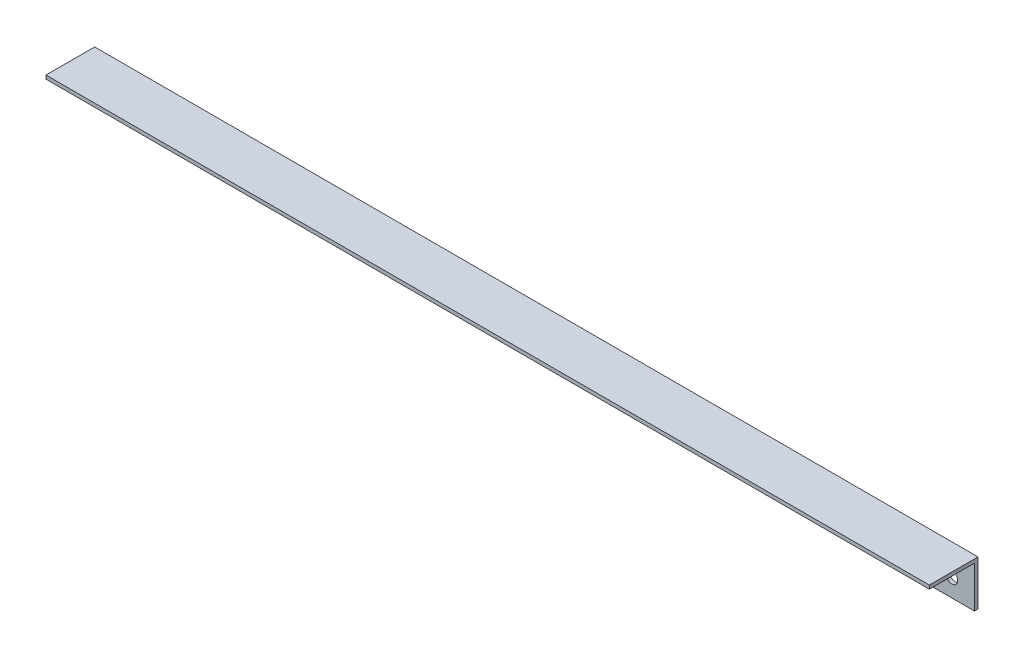
ISO-10303-21;
HEADER;
FILE_DESCRIPTION(('STEP AP214'),'2;1');
FILE_NAME('part.step','',(''),(''),'','','');
FILE_SCHEMA(('AUTOMOTIVE_DESIGN { 1 0 10303 214 1 1 1 1 }'));
ENDSEC;
DATA;
#1=APPLICATION_CONTEXT('core data for automotive mechanical design processes');
#2=APPLICATION_PROTOCOL_DEFINITION('international standard','automotive_design',2000,#1);
#3=PRODUCT_CONTEXT('',#1,'mechanical');
#4=PRODUCT('Part','Part','',(#3));
#5=PRODUCT_RELATED_PRODUCT_CATEGORY('part','',(#4));
#6=PRODUCT_DEFINITION_FORMATION('','',#4);
#7=PRODUCT_DEFINITION_CONTEXT('part definition',#1,'design');
#8=PRODUCT_DEFINITION('design','',#6,#7);
#9=PRODUCT_DEFINITION_SHAPE('','',#8);
#10=(LENGTH_UNIT() NAMED_UNIT(*) SI_UNIT(.MILLI.,.METRE.));
#11=(NAMED_UNIT(*) PLANE_ANGLE_UNIT() SI_UNIT($,.RADIAN.));
#12=(NAMED_UNIT(*) SI_UNIT($,.STERADIAN.) SOLID_ANGLE_UNIT());
#13=UNCERTAINTY_MEASURE_WITH_UNIT(LENGTH_MEASURE(1.E-05),#10,'distance_accuracy_value','');
#14=(GEOMETRIC_REPRESENTATION_CONTEXT(3) GLOBAL_UNCERTAINTY_ASSIGNED_CONTEXT((#13)) GLOBAL_UNIT_ASSIGNED_CONTEXT((#10,
#11,#12)) REPRESENTATION_CONTEXT('',''));
#15=CARTESIAN_POINT('',(0.,0.,0.));
#16=DIRECTION('',(0.,0.,1.));
#17=DIRECTION('',(1.,0.,0.));
#18=AXIS2_PLACEMENT_3D('',#15,#16,#17);
#19=CARTESIAN_POINT('',(-980.,-5.48788481732075,8.));
#20=DIRECTION('',(0.,0.,1.));
#21=DIRECTION('',(1.,0.,0.));
#22=AXIS2_PLACEMENT_3D('',#19,#20,#21);
#23=PLANE('',#22);
#24=DIRECTION('',(1.,0.,0.));
#25=VECTOR('',#24,1.);
#26=CARTESIAN_POINT('',(-980.,86.5121151826793,8.));
#27=LINE('',#26,#25);
#28=CARTESIAN_POINT('',(-980.,86.5121151826793,8.));
#29=VERTEX_POINT('',#28);
#30=CARTESIAN_POINT('',(980.,86.5121151826793,8.));
#31=VERTEX_POINT('',#30);
#32=EDGE_CURVE('E49',#29,#31,#27,.T.);
#33=ORIENTED_EDGE('',*,*,#32,.F.);
#34=DIRECTION('',(0.,-1.,0.));
#35=VECTOR('',#34,1.);
#36=CARTESIAN_POINT('',(-980.,94.5121151826794,8.));
#37=LINE('',#36,#35);
#38=CARTESIAN_POINT('',(-980.,-5.48788481732075,8.));
#39=VERTEX_POINT('',#38);
#40=EDGE_CURVE('E86',#29,#39,#37,.T.);
#41=ORIENTED_EDGE('',*,*,#40,.T.);
#42=DIRECTION('',(1.,0.,0.));
#43=VECTOR('',#42,1.);
#44=CARTESIAN_POINT('',(-980.,-5.48788481732075,8.));
#45=LINE('',#44,#43);
#46=CARTESIAN_POINT('',(980.,-5.48788481732075,8.));
#47=VERTEX_POINT('',#46);
#48=EDGE_CURVE('E55',#39,#47,#45,.T.);
#49=ORIENTED_EDGE('',*,*,#48,.T.);
#50=DIRECTION('',(0.,1.,0.));
#51=VECTOR('',#50,1.);
#52=CARTESIAN_POINT('',(980.,94.5121151826794,8.));
#53=LINE('',#52,#51);
#54=EDGE_CURVE('E97',#47,#31,#53,.T.);
#55=ORIENTED_EDGE('',*,*,#54,.T.);
#56=EDGE_LOOP('',(#33,#41,#49,#55));
#57=FACE_BOUND('',#56,.T.);
#58=CARTESIAN_POINT('',(-330.,34.5121151826793,8.));
#59=DIRECTION('',(0.,0.,1.));
#60=DIRECTION('',(-1.,0.,0.));
#61=AXIS2_PLACEMENT_3D('',#58,#59,#60);
#62=CIRCLE('',#61,13.);
#63=CARTESIAN_POINT('',(-343.,34.5121151826793,8.));
#64=VERTEX_POINT('',#63);
#65=EDGE_CURVE('E143',#64,#64,#62,.T.);
#66=ORIENTED_EDGE('',*,*,#65,.F.);
#67=EDGE_LOOP('',(#66));
#68=FACE_BOUND('',#67,.T.);
#69=CARTESIAN_POINT('',(-170.,34.5121151826792,8.));
#70=DIRECTION('',(0.,0.,1.));
#71=DIRECTION('',(-1.,0.,0.));
#72=AXIS2_PLACEMENT_3D('',#69,#70,#71);
#73=CIRCLE('',#72,13.);
#74=CARTESIAN_POINT('',(-183.,34.5121151826792,8.));
#75=VERTEX_POINT('',#74);
#76=EDGE_CURVE('E155',#75,#75,#73,.T.);
#77=ORIENTED_EDGE('',*,*,#76,.F.);
#78=EDGE_LOOP('',(#77));
#79=FACE_BOUND('',#78,.T.);
#80=CARTESIAN_POINT('',(-850.,34.5121151826793,8.));
#81=DIRECTION('',(0.,0.,1.));
#82=DIRECTION('',(-1.,0.,0.));
#83=AXIS2_PLACEMENT_3D('',#80,#81,#82);
#84=CIRCLE('',#83,13.);
#85=CARTESIAN_POINT('',(-863.,34.5121151826793,8.));
#86=VERTEX_POINT('',#85);
#87=EDGE_CURVE('E167',#86,#86,#84,.T.);
#88=ORIENTED_EDGE('',*,*,#87,.F.);
#89=EDGE_LOOP('',(#88));
#90=FACE_BOUND('',#89,.T.);
#91=CARTESIAN_POINT('',(250.,34.5121151826793,8.));
#92=DIRECTION('',(0.,0.,1.));
#93=DIRECTION('',(1.,0.,0.));
#94=AXIS2_PLACEMENT_3D('',#91,#92,#93);
#95=CIRCLE('',#94,13.);
#96=CARTESIAN_POINT('',(263.,34.5121151826793,8.));
#97=VERTEX_POINT('',#96);
#98=EDGE_CURVE('E179',#97,#97,#95,.T.);
#99=ORIENTED_EDGE('',*,*,#98,.F.);
#100=EDGE_LOOP('',(#99));
#101=FACE_BOUND('',#100,.T.);
#102=CARTESIAN_POINT('',(770.,34.5121151826793,8.));
#103=DIRECTION('',(0.,0.,1.));
#104=DIRECTION('',(1.,0.,0.));
#105=AXIS2_PLACEMENT_3D('',#102,#103,#104);
#106=CIRCLE('',#105,13.);
#107=CARTESIAN_POINT('',(783.,34.5121151826793,8.));
#108=VERTEX_POINT('',#107);
#109=EDGE_CURVE('E191',#108,#108,#106,.T.);
#110=ORIENTED_EDGE('',*,*,#109,.F.);
#111=EDGE_LOOP('',(#110));
#112=FACE_BOUND('',#111,.T.);
#113=CARTESIAN_POINT('',(930.,34.5121151826793,8.));
#114=DIRECTION('',(0.,0.,1.));
#115=DIRECTION('',(1.,0.,0.));
#116=AXIS2_PLACEMENT_3D('',#113,#114,#115);
#117=CIRCLE('',#116,13.);
#118=CARTESIAN_POINT('',(943.,34.5121151826793,8.));
#119=VERTEX_POINT('',#118);
#120=EDGE_CURVE('E102',#119,#119,#117,.T.);
#121=ORIENTED_EDGE('',*,*,#120,.F.);
#122=EDGE_LOOP('',(#121));
#123=FACE_BOUND('',#122,.T.);
#124=CARTESIAN_POINT('',(850.,34.5121151826793,8.));
#125=DIRECTION('',(0.,0.,1.));
#126=DIRECTION('',(1.,0.,0.));
#127=AXIS2_PLACEMENT_3D('',#124,#125,#126);
#128=CIRCLE('',#127,13.);
#129=CARTESIAN_POINT('',(863.,34.5121151826793,8.));
#130=VERTEX_POINT('',#129);
#131=EDGE_CURVE('E197',#130,#130,#128,.T.);
#132=ORIENTED_EDGE('',*,*,#131,.F.);
#133=EDGE_LOOP('',(#132));
#134=FACE_BOUND('',#133,.T.);
#135=CARTESIAN_POINT('',(330.,34.5121151826793,8.));
#136=DIRECTION('',(0.,0.,1.));
#137=DIRECTION('',(1.,0.,0.));
#138=AXIS2_PLACEMENT_3D('',#135,#136,#137);
#139=CIRCLE('',#138,13.);
#140=CARTESIAN_POINT('',(343.,34.5121151826793,8.));
#141=VERTEX_POINT('',#140);
#142=EDGE_CURVE('E185',#141,#141,#139,.T.);
#143=ORIENTED_EDGE('',*,*,#142,.F.);
#144=EDGE_LOOP('',(#143));
#145=FACE_BOUND('',#144,.T.);
#146=CARTESIAN_POINT('',(-770.,34.5121151826793,8.));
#147=DIRECTION('',(0.,0.,1.));
#148=DIRECTION('',(-1.,0.,0.));
#149=AXIS2_PLACEMENT_3D('',#146,#147,#148);
#150=CIRCLE('',#149,13.);
#151=CARTESIAN_POINT('',(-783.,34.5121151826793,8.));
#152=VERTEX_POINT('',#151);
#153=EDGE_CURVE('E173',#152,#152,#150,.T.);
#154=ORIENTED_EDGE('',*,*,#153,.F.);
#155=EDGE_LOOP('',(#154));
#156=FACE_BOUND('',#155,.T.);
#157=CARTESIAN_POINT('',(170.,34.5121151826792,8.));
#158=DIRECTION('',(0.,0.,1.));
#159=DIRECTION('',(1.,0.,0.));
#160=AXIS2_PLACEMENT_3D('',#157,#158,#159);
#161=CIRCLE('',#160,13.);
#162=CARTESIAN_POINT('',(183.,34.5121151826792,8.));
#163=VERTEX_POINT('',#162);
#164=EDGE_CURVE('E161',#163,#163,#161,.T.);
#165=ORIENTED_EDGE('',*,*,#164,.F.);
#166=EDGE_LOOP('',(#165));
#167=FACE_BOUND('',#166,.T.);
#168=CARTESIAN_POINT('',(-250.,34.5121151826793,8.));
#169=DIRECTION('',(0.,0.,1.));
#170=DIRECTION('',(-1.,0.,0.));
#171=AXIS2_PLACEMENT_3D('',#168,#169,#170);
#172=CIRCLE('',#171,13.);
#173=CARTESIAN_POINT('',(-263.,34.5121151826793,8.));
#174=VERTEX_POINT('',#173);
#175=EDGE_CURVE('E149',#174,#174,#172,.T.);
#176=ORIENTED_EDGE('',*,*,#175,.F.);
#177=EDGE_LOOP('',(#176));
#178=FACE_BOUND('',#177,.T.);
#179=CARTESIAN_POINT('',(-930.,34.5121151826793,8.));
#180=DIRECTION('',(0.,0.,1.));
#181=DIRECTION('',(-1.,0.,0.));
#182=AXIS2_PLACEMENT_3D('',#179,#180,#181);
#183=CIRCLE('',#182,13.);
#184=CARTESIAN_POINT('',(-943.,34.5121151826793,8.));
#185=VERTEX_POINT('',#184);
#186=EDGE_CURVE('E134',#185,#185,#183,.T.);
#187=ORIENTED_EDGE('',*,*,#186,.F.);
#188=EDGE_LOOP('',(#187));
#189=FACE_BOUND('',#188,.T.);
#190=ADVANCED_FACE('F34',(#57,#68,#79,#90,#101,#112,#123,#134,#145,#156,#167,#178,#189),#23,.T.);
#191=CARTESIAN_POINT('',(-980.,-5.48788481732075,0.));
#192=DIRECTION('',(0.,0.,1.));
#193=DIRECTION('',(1.,0.,0.));
#194=AXIS2_PLACEMENT_3D('',#191,#192,#193);
#195=PLANE('',#194);
#196=DIRECTION('',(0.,-1.,0.));
#197=VECTOR('',#196,1.);
#198=CARTESIAN_POINT('',(-980.,94.5121151826794,0.));
#199=LINE('',#198,#197);
#200=CARTESIAN_POINT('',(-980.,94.5121151826794,0.));
#201=VERTEX_POINT('',#200);
#202=CARTESIAN_POINT('',(-980.,-5.48788481732075,0.));
#203=VERTEX_POINT('',#202);
#204=EDGE_CURVE('E93',#201,#203,#199,.T.);
#205=ORIENTED_EDGE('',*,*,#204,.F.);
#206=DIRECTION('',(-1.,0.,0.));
#207=VECTOR('',#206,1.);
#208=CARTESIAN_POINT('',(-980.,94.5121151826794,0.));
#209=LINE('',#208,#207);
#210=CARTESIAN_POINT('',(980.,94.5121151826794,0.));
#211=VERTEX_POINT('',#210);
#212=EDGE_CURVE('E75',#211,#201,#209,.T.);
#213=ORIENTED_EDGE('',*,*,#212,.F.);
#214=DIRECTION('',(0.,1.,0.));
#215=VECTOR('',#214,1.);
#216=CARTESIAN_POINT('',(980.,94.5121151826794,0.));
#217=LINE('',#216,#215);
#218=CARTESIAN_POINT('',(980.,-5.48788481732075,0.));
#219=VERTEX_POINT('',#218);
#220=EDGE_CURVE('E87',#219,#211,#217,.T.);
#221=ORIENTED_EDGE('',*,*,#220,.F.);
#222=DIRECTION('',(1.,0.,0.));
#223=VECTOR('',#222,1.);
#224=CARTESIAN_POINT('',(-980.,-5.48788481732075,0.));
#225=LINE('',#224,#223);
#226=EDGE_CURVE('E101',#203,#219,#225,.T.);
#227=ORIENTED_EDGE('',*,*,#226,.F.);
#228=EDGE_LOOP('',(#205,#213,#221,#227));
#229=FACE_BOUND('',#228,.T.);
#230=CARTESIAN_POINT('',(930.,34.5121151826793,0.));
#231=DIRECTION('',(0.,0.,1.));
#232=DIRECTION('',(1.,0.,0.));
#233=AXIS2_PLACEMENT_3D('',#230,#231,#232);
#234=CIRCLE('',#233,13.);
#235=CARTESIAN_POINT('',(943.,34.5121151826793,0.));
#236=VERTEX_POINT('',#235);
#237=EDGE_CURVE('E106',#236,#236,#234,.T.);
#238=ORIENTED_EDGE('',*,*,#237,.T.);
#239=EDGE_LOOP('',(#238));
#240=FACE_BOUND('',#239,.T.);
#241=CARTESIAN_POINT('',(850.,34.5121151826793,0.));
#242=DIRECTION('',(0.,0.,1.));
#243=DIRECTION('',(1.,0.,0.));
#244=AXIS2_PLACEMENT_3D('',#241,#242,#243);
#245=CIRCLE('',#244,13.);
#246=CARTESIAN_POINT('',(863.,34.5121151826793,0.));
#247=VERTEX_POINT('',#246);
#248=EDGE_CURVE('E194',#247,#247,#245,.T.);
#249=ORIENTED_EDGE('',*,*,#248,.T.);
#250=EDGE_LOOP('',(#249));
#251=FACE_BOUND('',#250,.T.);
#252=CARTESIAN_POINT('',(770.,34.5121151826793,0.));
#253=DIRECTION('',(0.,0.,1.));
#254=DIRECTION('',(1.,0.,0.));
#255=AXIS2_PLACEMENT_3D('',#252,#253,#254);
#256=CIRCLE('',#255,13.);
#257=CARTESIAN_POINT('',(783.,34.5121151826793,0.));
#258=VERTEX_POINT('',#257);
#259=EDGE_CURVE('E188',#258,#258,#256,.T.);
#260=ORIENTED_EDGE('',*,*,#259,.T.);
#261=EDGE_LOOP('',(#260));
#262=FACE_BOUND('',#261,.T.);
#263=CARTESIAN_POINT('',(330.,34.5121151826793,0.));
#264=DIRECTION('',(0.,0.,1.));
#265=DIRECTION('',(1.,0.,0.));
#266=AXIS2_PLACEMENT_3D('',#263,#264,#265);
#267=CIRCLE('',#266,13.);
#268=CARTESIAN_POINT('',(343.,34.5121151826793,0.));
#269=VERTEX_POINT('',#268);
#270=EDGE_CURVE('E182',#269,#269,#267,.T.);
#271=ORIENTED_EDGE('',*,*,#270,.T.);
#272=EDGE_LOOP('',(#271));
#273=FACE_BOUND('',#272,.T.);
#274=CARTESIAN_POINT('',(250.,34.5121151826793,0.));
#275=DIRECTION('',(0.,0.,1.));
#276=DIRECTION('',(1.,0.,0.));
#277=AXIS2_PLACEMENT_3D('',#274,#275,#276);
#278=CIRCLE('',#277,13.);
#279=CARTESIAN_POINT('',(263.,34.5121151826793,0.));
#280=VERTEX_POINT('',#279);
#281=EDGE_CURVE('E176',#280,#280,#278,.T.);
#282=ORIENTED_EDGE('',*,*,#281,.T.);
#283=EDGE_LOOP('',(#282));
#284=FACE_BOUND('',#283,.T.);
#285=CARTESIAN_POINT('',(-770.,34.5121151826793,0.));
#286=DIRECTION('',(0.,0.,1.));
#287=DIRECTION('',(-1.,0.,0.));
#288=AXIS2_PLACEMENT_3D('',#285,#286,#287);
#289=CIRCLE('',#288,13.);
#290=CARTESIAN_POINT('',(-783.,34.5121151826793,0.));
#291=VERTEX_POINT('',#290);
#292=EDGE_CURVE('E170',#291,#291,#289,.T.);
#293=ORIENTED_EDGE('',*,*,#292,.T.);
#294=EDGE_LOOP('',(#293));
#295=FACE_BOUND('',#294,.T.);
#296=CARTESIAN_POINT('',(-850.,34.5121151826793,0.));
#297=DIRECTION('',(0.,0.,1.));
#298=DIRECTION('',(-1.,0.,0.));
#299=AXIS2_PLACEMENT_3D('',#296,#297,#298);
#300=CIRCLE('',#299,13.);
#301=CARTESIAN_POINT('',(-863.,34.5121151826793,0.));
#302=VERTEX_POINT('',#301);
#303=EDGE_CURVE('E164',#302,#302,#300,.T.);
#304=ORIENTED_EDGE('',*,*,#303,.T.);
#305=EDGE_LOOP('',(#304));
#306=FACE_BOUND('',#305,.T.);
#307=CARTESIAN_POINT('',(170.,34.5121151826792,0.));
#308=DIRECTION('',(0.,0.,1.));
#309=DIRECTION('',(1.,0.,0.));
#310=AXIS2_PLACEMENT_3D('',#307,#308,#309);
#311=CIRCLE('',#310,13.);
#312=CARTESIAN_POINT('',(183.,34.5121151826792,0.));
#313=VERTEX_POINT('',#312);
#314=EDGE_CURVE('E158',#313,#313,#311,.T.);
#315=ORIENTED_EDGE('',*,*,#314,.T.);
#316=EDGE_LOOP('',(#315));
#317=FACE_BOUND('',#316,.T.);
#318=CARTESIAN_POINT('',(-170.,34.5121151826792,0.));
#319=DIRECTION('',(0.,0.,1.));
#320=DIRECTION('',(-1.,0.,0.));
#321=AXIS2_PLACEMENT_3D('',#318,#319,#320);
#322=CIRCLE('',#321,13.);
#323=CARTESIAN_POINT('',(-183.,34.5121151826792,0.));
#324=VERTEX_POINT('',#323);
#325=EDGE_CURVE('E152',#324,#324,#322,.T.);
#326=ORIENTED_EDGE('',*,*,#325,.T.);
#327=EDGE_LOOP('',(#326));
#328=FACE_BOUND('',#327,.T.);
#329=CARTESIAN_POINT('',(-250.,34.5121151826793,0.));
#330=DIRECTION('',(0.,0.,1.));
#331=DIRECTION('',(-1.,0.,0.));
#332=AXIS2_PLACEMENT_3D('',#329,#330,#331);
#333=CIRCLE('',#332,13.);
#334=CARTESIAN_POINT('',(-263.,34.5121151826793,0.));
#335=VERTEX_POINT('',#334);
#336=EDGE_CURVE('E146',#335,#335,#333,.T.);
#337=ORIENTED_EDGE('',*,*,#336,.T.);
#338=EDGE_LOOP('',(#337));
#339=FACE_BOUND('',#338,.T.);
#340=CARTESIAN_POINT('',(-330.,34.5121151826793,0.));
#341=DIRECTION('',(0.,0.,1.));
#342=DIRECTION('',(-1.,0.,0.));
#343=AXIS2_PLACEMENT_3D('',#340,#341,#342);
#344=CIRCLE('',#343,13.);
#345=CARTESIAN_POINT('',(-343.,34.5121151826793,0.));
#346=VERTEX_POINT('',#345);
#347=EDGE_CURVE('E141',#346,#346,#344,.T.);
#348=ORIENTED_EDGE('',*,*,#347,.T.);
#349=EDGE_LOOP('',(#348));
#350=FACE_BOUND('',#349,.T.);
#351=CARTESIAN_POINT('',(-930.,34.5121151826793,0.));
#352=DIRECTION('',(0.,0.,1.));
#353=DIRECTION('',(-1.,0.,0.));
#354=AXIS2_PLACEMENT_3D('',#351,#352,#353);
#355=CIRCLE('',#354,13.);
#356=CARTESIAN_POINT('',(-943.,34.5121151826793,0.));
#357=VERTEX_POINT('',#356);
#358=EDGE_CURVE('E130',#357,#357,#355,.T.);
#359=ORIENTED_EDGE('',*,*,#358,.T.);
#360=EDGE_LOOP('',(#359));
#361=FACE_BOUND('',#360,.T.);
#362=ADVANCED_FACE('F99',(#229,#240,#251,#262,#273,#284,#295,#306,#317,#328,#339,#350,#361),
#195,.F.);
#363=CARTESIAN_POINT('',(-980.,94.5121151826794,8.));
#364=DIRECTION('',(1.,0.,0.));
#365=DIRECTION('',(0.,0.,-1.));
#366=AXIS2_PLACEMENT_3D('',#363,#364,#365);
#367=PLANE('',#366);
#368=ORIENTED_EDGE('',*,*,#204,.T.);
#369=DIRECTION('',(0.,0.,-1.));
#370=VECTOR('',#369,1.);
#371=CARTESIAN_POINT('',(-980.,-5.48788481732075,8.));
#372=LINE('',#371,#370);
#373=EDGE_CURVE('E11',#39,#203,#372,.T.);
#374=ORIENTED_EDGE('',*,*,#373,.F.);
#375=ORIENTED_EDGE('',*,*,#40,.F.);
#376=DIRECTION('',(0.,0.,-1.));
#377=VECTOR('',#376,1.);
#378=CARTESIAN_POINT('',(-980.,86.5121151826793,108.));
#379=LINE('',#378,#377);
#380=CARTESIAN_POINT('',(-980.,86.5121151826793,108.));
#381=VERTEX_POINT('',#380);
#382=EDGE_CURVE('E121',#381,#29,#379,.T.);
#383=ORIENTED_EDGE('',*,*,#382,.F.);
#384=DIRECTION('',(0.,-1.,0.));
#385=VECTOR('',#384,1.);
#386=CARTESIAN_POINT('',(-980.,94.5121151826794,108.));
#387=LINE('',#386,#385);
#388=CARTESIAN_POINT('',(-980.,94.5121151826794,108.));
#389=VERTEX_POINT('',#388);
#390=EDGE_CURVE('E96',#389,#381,#387,.T.);
#391=ORIENTED_EDGE('',*,*,#390,.F.);
#392=DIRECTION('',(0.,0.,-1.));
#393=VECTOR('',#392,1.);
#394=CARTESIAN_POINT('',(-980.,94.5121151826794,8.));
#395=LINE('',#394,#393);
#396=EDGE_CURVE('E79',#389,#201,#395,.T.);
#397=ORIENTED_EDGE('',*,*,#396,.T.);
#398=EDGE_LOOP('',(#368,#374,#375,#383,#391,#397));
#399=FACE_BOUND('',#398,.T.);
#400=ADVANCED_FACE('F36',(#399),#367,.F.);
#401=CARTESIAN_POINT('',(-980.,-5.48788481732075,8.));
#402=DIRECTION('',(0.,1.,0.));
#403=DIRECTION('',(0.,0.,1.));
#404=AXIS2_PLACEMENT_3D('',#401,#402,#403);
#405=PLANE('',#404);
#406=ORIENTED_EDGE('',*,*,#226,.T.);
#407=DIRECTION('',(0.,0.,-1.));
#408=VECTOR('',#407,1.);
#409=CARTESIAN_POINT('',(980.,-5.48788481732075,8.));
#410=LINE('',#409,#408);
#411=EDGE_CURVE('E42',#47,#219,#410,.T.);
#412=ORIENTED_EDGE('',*,*,#411,.F.);
#413=ORIENTED_EDGE('',*,*,#48,.F.);
#414=ORIENTED_EDGE('',*,*,#373,.T.);
#415=EDGE_LOOP('',(#406,#412,#413,#414));
#416=FACE_BOUND('',#415,.T.);
#417=ADVANCED_FACE('F118',(#416),#405,.F.);
#418=CARTESIAN_POINT('',(980.,94.5121151826794,8.));
#419=DIRECTION('',(-1.,0.,0.));
#420=DIRECTION('',(0.,0.,1.));
#421=AXIS2_PLACEMENT_3D('',#418,#419,#420);
#422=PLANE('',#421);
#423=ORIENTED_EDGE('',*,*,#220,.T.);
#424=DIRECTION('',(0.,0.,-1.));
#425=VECTOR('',#424,1.);
#426=CARTESIAN_POINT('',(980.,94.5121151826794,8.));
#427=LINE('',#426,#425);
#428=CARTESIAN_POINT('',(980.,94.5121151826794,108.));
#429=VERTEX_POINT('',#428);
#430=EDGE_CURVE('E82',#429,#211,#427,.T.);
#431=ORIENTED_EDGE('',*,*,#430,.F.);
#432=DIRECTION('',(0.,1.,0.));
#433=VECTOR('',#432,1.);
#434=CARTESIAN_POINT('',(980.,94.5121151826794,108.));
#435=LINE('',#434,#433);
#436=CARTESIAN_POINT('',(980.,86.5121151826793,108.));
#437=VERTEX_POINT('',#436);
#438=EDGE_CURVE('E214',#437,#429,#435,.T.);
#439=ORIENTED_EDGE('',*,*,#438,.F.);
#440=DIRECTION('',(0.,0.,-1.));
#441=VECTOR('',#440,1.);
#442=CARTESIAN_POINT('',(980.,86.5121151826793,108.));
#443=LINE('',#442,#441);
#444=EDGE_CURVE('E131',#437,#31,#443,.T.);
#445=ORIENTED_EDGE('',*,*,#444,.T.);
#446=ORIENTED_EDGE('',*,*,#54,.F.);
#447=ORIENTED_EDGE('',*,*,#411,.T.);
#448=EDGE_LOOP('',(#423,#431,#439,#445,#446,#447));
#449=FACE_BOUND('',#448,.T.);
#450=ADVANCED_FACE('F115',(#449),#422,.F.);
#451=CARTESIAN_POINT('',(-980.,94.5121151826794,8.));
#452=DIRECTION('',(0.,-1.,0.));
#453=DIRECTION('',(0.,0.,-1.));
#454=AXIS2_PLACEMENT_3D('',#451,#452,#453);
#455=PLANE('',#454);
#456=ORIENTED_EDGE('',*,*,#212,.T.);
#457=ORIENTED_EDGE('',*,*,#396,.F.);
#458=DIRECTION('',(-1.,0.,0.));
#459=VECTOR('',#458,1.);
#460=CARTESIAN_POINT('',(-980.,94.5121151826794,108.));
#461=LINE('',#460,#459);
#462=EDGE_CURVE('E136',#429,#389,#461,.T.);
#463=ORIENTED_EDGE('',*,*,#462,.F.);
#464=ORIENTED_EDGE('',*,*,#430,.T.);
#465=EDGE_LOOP('',(#456,#457,#463,#464));
#466=FACE_BOUND('',#465,.T.);
#467=ADVANCED_FACE('F77',(#466),#455,.F.);
#468=CARTESIAN_POINT('',(930.,34.5121151826793,8.));
#469=DIRECTION('',(0.,0.,-1.));
#470=DIRECTION('',(-1.,0.,0.));
#471=AXIS2_PLACEMENT_3D('',#468,#469,#470);
#472=CYLINDRICAL_SURFACE('',#471,13.);
#473=ORIENTED_EDGE('',*,*,#120,.T.);
#474=EDGE_LOOP('',(#473));
#475=FACE_BOUND('',#474,.T.);
#476=ORIENTED_EDGE('',*,*,#237,.F.);
#477=EDGE_LOOP('',(#476));
#478=FACE_BOUND('',#477,.T.);
#479=ADVANCED_FACE('F233',(#475,#478),#472,.F.);
#480=CARTESIAN_POINT('',(850.,34.5121151826793,8.));
#481=DIRECTION('',(0.,0.,-1.));
#482=DIRECTION('',(-1.,0.,0.));
#483=AXIS2_PLACEMENT_3D('',#480,#481,#482);
#484=CYLINDRICAL_SURFACE('',#483,13.);
#485=ORIENTED_EDGE('',*,*,#131,.T.);
#486=EDGE_LOOP('',(#485));
#487=FACE_BOUND('',#486,.T.);
#488=ORIENTED_EDGE('',*,*,#248,.F.);
#489=EDGE_LOOP('',(#488));
#490=FACE_BOUND('',#489,.T.);
#491=ADVANCED_FACE('F266',(#487,#490),#484,.F.);
#492=CARTESIAN_POINT('',(770.,34.5121151826793,8.));
#493=DIRECTION('',(0.,0.,-1.));
#494=DIRECTION('',(-1.,0.,0.));
#495=AXIS2_PLACEMENT_3D('',#492,#493,#494);
#496=CYLINDRICAL_SURFACE('',#495,13.);
#497=ORIENTED_EDGE('',*,*,#109,.T.);
#498=EDGE_LOOP('',(#497));
#499=FACE_BOUND('',#498,.T.);
#500=ORIENTED_EDGE('',*,*,#259,.F.);
#501=EDGE_LOOP('',(#500));
#502=FACE_BOUND('',#501,.T.);
#503=ADVANCED_FACE('F276',(#499,#502),#496,.F.);
#504=CARTESIAN_POINT('',(330.,34.5121151826793,8.));
#505=DIRECTION('',(0.,0.,-1.));
#506=DIRECTION('',(-1.,0.,0.));
#507=AXIS2_PLACEMENT_3D('',#504,#505,#506);
#508=CYLINDRICAL_SURFACE('',#507,13.);
#509=ORIENTED_EDGE('',*,*,#142,.T.);
#510=EDGE_LOOP('',(#509));
#511=FACE_BOUND('',#510,.T.);
#512=ORIENTED_EDGE('',*,*,#270,.F.);
#513=EDGE_LOOP('',(#512));
#514=FACE_BOUND('',#513,.T.);
#515=ADVANCED_FACE('F285',(#511,#514),#508,.F.);
#516=CARTESIAN_POINT('',(250.,34.5121151826793,8.));
#517=DIRECTION('',(0.,0.,-1.));
#518=DIRECTION('',(-1.,0.,0.));
#519=AXIS2_PLACEMENT_3D('',#516,#517,#518);
#520=CYLINDRICAL_SURFACE('',#519,13.);
#521=ORIENTED_EDGE('',*,*,#98,.T.);
#522=EDGE_LOOP('',(#521));
#523=FACE_BOUND('',#522,.T.);
#524=ORIENTED_EDGE('',*,*,#281,.F.);
#525=EDGE_LOOP('',(#524));
#526=FACE_BOUND('',#525,.T.);
#527=ADVANCED_FACE('F295',(#523,#526),#520,.F.);
#528=CARTESIAN_POINT('',(-770.,34.5121151826793,8.));
#529=DIRECTION('',(0.,0.,-1.));
#530=DIRECTION('',(-1.,0.,0.));
#531=AXIS2_PLACEMENT_3D('',#528,#529,#530);
#532=CYLINDRICAL_SURFACE('',#531,13.);
#533=ORIENTED_EDGE('',*,*,#153,.T.);
#534=EDGE_LOOP('',(#533));
#535=FACE_BOUND('',#534,.T.);
#536=ORIENTED_EDGE('',*,*,#292,.F.);
#537=EDGE_LOOP('',(#536));
#538=FACE_BOUND('',#537,.T.);
#539=ADVANCED_FACE('F305',(#535,#538),#532,.F.);
#540=CARTESIAN_POINT('',(-850.,34.5121151826793,8.));
#541=DIRECTION('',(0.,0.,-1.));
#542=DIRECTION('',(-1.,0.,0.));
#543=AXIS2_PLACEMENT_3D('',#540,#541,#542);
#544=CYLINDRICAL_SURFACE('',#543,13.);
#545=ORIENTED_EDGE('',*,*,#87,.T.);
#546=EDGE_LOOP('',(#545));
#547=FACE_BOUND('',#546,.T.);
#548=ORIENTED_EDGE('',*,*,#303,.F.);
#549=EDGE_LOOP('',(#548));
#550=FACE_BOUND('',#549,.T.);
#551=ADVANCED_FACE('F315',(#547,#550),#544,.F.);
#552=CARTESIAN_POINT('',(170.,34.5121151826792,8.));
#553=DIRECTION('',(0.,0.,-1.));
#554=DIRECTION('',(-1.,0.,0.));
#555=AXIS2_PLACEMENT_3D('',#552,#553,#554);
#556=CYLINDRICAL_SURFACE('',#555,13.);
#557=ORIENTED_EDGE('',*,*,#164,.T.);
#558=EDGE_LOOP('',(#557));
#559=FACE_BOUND('',#558,.T.);
#560=ORIENTED_EDGE('',*,*,#314,.F.);
#561=EDGE_LOOP('',(#560));
#562=FACE_BOUND('',#561,.T.);
#563=ADVANCED_FACE('F325',(#559,#562),#556,.F.);
#564=CARTESIAN_POINT('',(-170.,34.5121151826792,8.));
#565=DIRECTION('',(0.,0.,-1.));
#566=DIRECTION('',(-1.,0.,0.));
#567=AXIS2_PLACEMENT_3D('',#564,#565,#566);
#568=CYLINDRICAL_SURFACE('',#567,13.);
#569=ORIENTED_EDGE('',*,*,#76,.T.);
#570=EDGE_LOOP('',(#569));
#571=FACE_BOUND('',#570,.T.);
#572=ORIENTED_EDGE('',*,*,#325,.F.);
#573=EDGE_LOOP('',(#572));
#574=FACE_BOUND('',#573,.T.);
#575=ADVANCED_FACE('F335',(#571,#574),#568,.F.);
#576=CARTESIAN_POINT('',(-250.,34.5121151826793,8.));
#577=DIRECTION('',(0.,0.,-1.));
#578=DIRECTION('',(-1.,0.,0.));
#579=AXIS2_PLACEMENT_3D('',#576,#577,#578);
#580=CYLINDRICAL_SURFACE('',#579,13.);
#581=ORIENTED_EDGE('',*,*,#175,.T.);
#582=EDGE_LOOP('',(#581));
#583=FACE_BOUND('',#582,.T.);
#584=ORIENTED_EDGE('',*,*,#336,.F.);
#585=EDGE_LOOP('',(#584));
#586=FACE_BOUND('',#585,.T.);
#587=ADVANCED_FACE('F345',(#583,#586),#580,.F.);
#588=CARTESIAN_POINT('',(-330.,34.5121151826793,8.));
#589=DIRECTION('',(0.,0.,-1.));
#590=DIRECTION('',(-1.,0.,0.));
#591=AXIS2_PLACEMENT_3D('',#588,#589,#590);
#592=CYLINDRICAL_SURFACE('',#591,13.);
#593=ORIENTED_EDGE('',*,*,#65,.T.);
#594=EDGE_LOOP('',(#593));
#595=FACE_BOUND('',#594,.T.);
#596=ORIENTED_EDGE('',*,*,#347,.F.);
#597=EDGE_LOOP('',(#596));
#598=FACE_BOUND('',#597,.T.);
#599=ADVANCED_FACE('F355',(#595,#598),#592,.F.);
#600=CARTESIAN_POINT('',(-930.,34.5121151826793,8.));
#601=DIRECTION('',(0.,0.,-1.));
#602=DIRECTION('',(-1.,0.,0.));
#603=AXIS2_PLACEMENT_3D('',#600,#601,#602);
#604=CYLINDRICAL_SURFACE('',#603,13.);
#605=ORIENTED_EDGE('',*,*,#186,.T.);
#606=EDGE_LOOP('',(#605));
#607=FACE_BOUND('',#606,.T.);
#608=ORIENTED_EDGE('',*,*,#358,.F.);
#609=EDGE_LOOP('',(#608));
#610=FACE_BOUND('',#609,.T.);
#611=ADVANCED_FACE('F224',(#607,#610),#604,.F.);
#612=CARTESIAN_POINT('',(-980.,86.5121151826793,108.));
#613=DIRECTION('',(0.,1.,0.));
#614=DIRECTION('',(0.,0.,1.));
#615=AXIS2_PLACEMENT_3D('',#612,#613,#614);
#616=PLANE('',#615);
#617=ORIENTED_EDGE('',*,*,#32,.T.);
#618=ORIENTED_EDGE('',*,*,#444,.F.);
#619=DIRECTION('',(1.,0.,0.));
#620=VECTOR('',#619,1.);
#621=CARTESIAN_POINT('',(-980.,86.5121151826793,108.));
#622=LINE('',#621,#620);
#623=EDGE_CURVE('E129',#381,#437,#622,.T.);
#624=ORIENTED_EDGE('',*,*,#623,.F.);
#625=ORIENTED_EDGE('',*,*,#382,.T.);
#626=EDGE_LOOP('',(#617,#618,#624,#625));
#627=FACE_BOUND('',#626,.T.);
#628=ADVANCED_FACE('F125',(#627),#616,.F.);
#629=CARTESIAN_POINT('',(-980.,86.5121151826793,108.));
#630=DIRECTION('',(0.,0.,1.));
#631=DIRECTION('',(1.,0.,0.));
#632=AXIS2_PLACEMENT_3D('',#629,#630,#631);
#633=PLANE('',#632);
#634=ORIENTED_EDGE('',*,*,#390,.T.);
#635=ORIENTED_EDGE('',*,*,#623,.T.);
#636=ORIENTED_EDGE('',*,*,#438,.T.);
#637=ORIENTED_EDGE('',*,*,#462,.T.);
#638=EDGE_LOOP('',(#634,#635,#636,#637));
#639=FACE_BOUND('',#638,.T.);
#640=ADVANCED_FACE('F212',(#639),#633,.T.);
#641=CLOSED_SHELL('',(#190,#362,#400,#417,#450,#467,#479,#491,#503,#515,#527,#539,#551,#563,
#575,#587,#599,#611,#628,#640));
#642=MANIFOLD_SOLID_BREP('B2',#641);
#643=ADVANCED_BREP_SHAPE_REPRESENTATION('',(#18,#642),#14);
#644=SHAPE_DEFINITION_REPRESENTATION(#9,#643);
ENDSEC;
END-ISO-10303-21;
